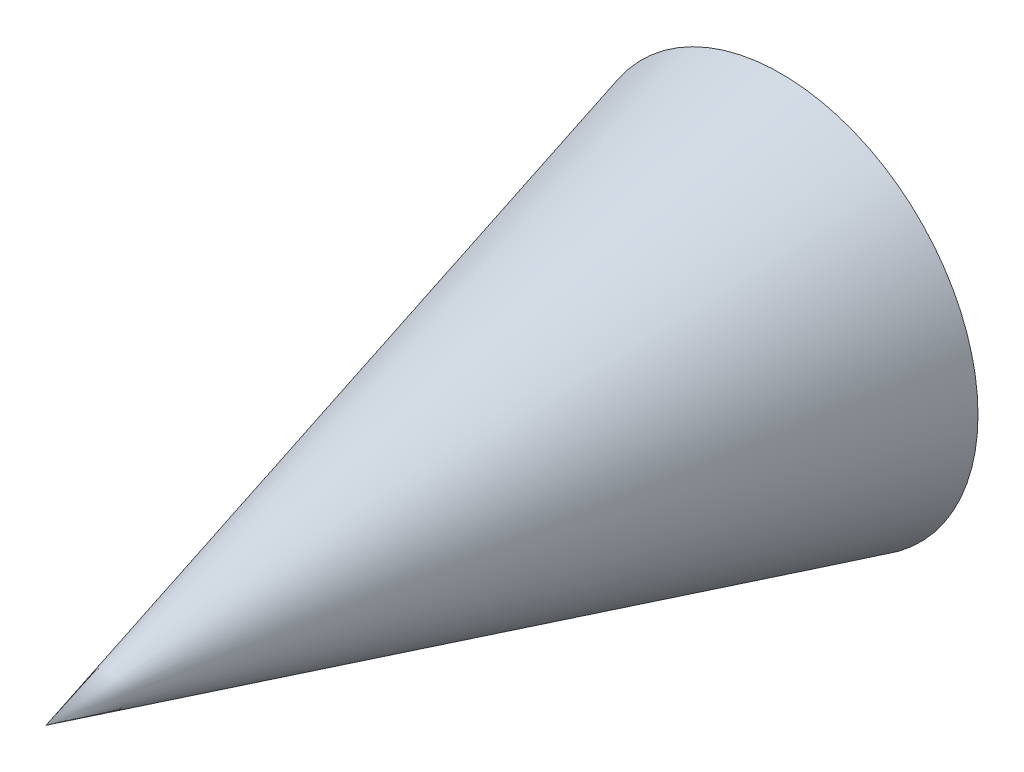
ISO-10303-21;
HEADER;
FILE_DESCRIPTION(('STEP AP214'),'2;1');
FILE_NAME('part.step','',(''),(''),'','','');
FILE_SCHEMA(('AUTOMOTIVE_DESIGN { 1 0 10303 214 1 1 1 1 }'));
ENDSEC;
DATA;
#1=APPLICATION_CONTEXT('core data for automotive mechanical design processes');
#2=APPLICATION_PROTOCOL_DEFINITION('international standard','automotive_design',2000,#1);
#3=PRODUCT_CONTEXT('',#1,'mechanical');
#4=PRODUCT('Part','Part','',(#3));
#5=PRODUCT_RELATED_PRODUCT_CATEGORY('part','',(#4));
#6=PRODUCT_DEFINITION_FORMATION('','',#4);
#7=PRODUCT_DEFINITION_CONTEXT('part definition',#1,'design');
#8=PRODUCT_DEFINITION('design','',#6,#7);
#9=PRODUCT_DEFINITION_SHAPE('','',#8);
#10=(LENGTH_UNIT() NAMED_UNIT(*) SI_UNIT(.MILLI.,.METRE.));
#11=(NAMED_UNIT(*) PLANE_ANGLE_UNIT() SI_UNIT($,.RADIAN.));
#12=(NAMED_UNIT(*) SI_UNIT($,.STERADIAN.) SOLID_ANGLE_UNIT());
#13=UNCERTAINTY_MEASURE_WITH_UNIT(LENGTH_MEASURE(1.E-05),#10,'distance_accuracy_value','');
#14=(GEOMETRIC_REPRESENTATION_CONTEXT(3) GLOBAL_UNCERTAINTY_ASSIGNED_CONTEXT((#13)) GLOBAL_UNIT_ASSIGNED_CONTEXT((#10,
#11,#12)) REPRESENTATION_CONTEXT('',''));
#15=CARTESIAN_POINT('',(0.,0.,0.));
#16=DIRECTION('',(0.,0.,1.));
#17=DIRECTION('',(1.,0.,0.));
#18=AXIS2_PLACEMENT_3D('',#15,#16,#17);
#19=CARTESIAN_POINT('',(0.,0.,0.));
#20=DIRECTION('',(0.,0.,-1.));
#21=DIRECTION('',(-1.,0.,0.));
#22=AXIS2_PLACEMENT_3D('',#19,#20,#21);
#23=CONICAL_SURFACE('',#22,0.,0.26179938779915);
#24=CARTESIAN_POINT('',(0.,0.,-27.9903810567665));
#25=DIRECTION('',(0.,0.,1.));
#26=DIRECTION('',(1.,0.,0.));
#27=AXIS2_PLACEMENT_3D('',#24,#25,#26);
#28=CIRCLE('',#27,7.5);
#29=CARTESIAN_POINT('',(7.5,0.,-27.9903810567665));
#30=VERTEX_POINT('',#29);
#31=EDGE_CURVE('E11',#30,#30,#28,.T.);
#32=ORIENTED_EDGE('',*,*,#31,.T.);
#33=EDGE_LOOP('',(#32));
#34=FACE_BOUND('',#33,.T.);
#35=CARTESIAN_POINT('',(0.,0.,0.));
#36=VERTEX_POINT('',#35);
#37=VERTEX_LOOP('',#36);
#38=FACE_BOUND('',#37,.T.);
#39=ADVANCED_FACE('F39',(#34,#38),#23,.T.);
#40=CARTESIAN_POINT('',(0.,7.5,-27.9903810567665));
#41=DIRECTION('',(0.,0.,-1.));
#42=DIRECTION('',(-1.,0.,0.));
#43=AXIS2_PLACEMENT_3D('',#40,#41,#42);
#44=PLANE('',#43);
#45=CARTESIAN_POINT('',(0.,0.,-27.9903810567665));
#46=DIRECTION('',(0.,0.,1.));
#47=DIRECTION('',(1.,0.,0.));
#48=AXIS2_PLACEMENT_3D('',#45,#46,#47);
#49=CIRCLE('',#48,6.46472381958992);
#50=CARTESIAN_POINT('',(6.46472381958992,0.,-27.9903810567665));
#51=VERTEX_POINT('',#50);
#52=EDGE_CURVE('E47',#51,#51,#49,.T.);
#53=ORIENTED_EDGE('',*,*,#52,.T.);
#54=EDGE_LOOP('',(#53));
#55=FACE_BOUND('',#54,.T.);
#56=ORIENTED_EDGE('',*,*,#31,.F.);
#57=EDGE_LOOP('',(#56));
#58=FACE_BOUND('',#57,.T.);
#59=ADVANCED_FACE('F55',(#55,#58),#44,.T.);
#60=CARTESIAN_POINT('',(0.,0.,-3.86370330515626));
#61=DIRECTION('',(0.,0.,-1.));
#62=DIRECTION('',(-1.,0.,0.));
#63=AXIS2_PLACEMENT_3D('',#60,#61,#62);
#64=CONICAL_SURFACE('',#63,0.,0.26179938779915);
#65=ORIENTED_EDGE('',*,*,#52,.F.);
#66=EDGE_LOOP('',(#65));
#67=FACE_BOUND('',#66,.T.);
#68=CARTESIAN_POINT('',(0.,0.,-3.86370330515626));
#69=VERTEX_POINT('',#68);
#70=VERTEX_LOOP('',#69);
#71=FACE_BOUND('',#70,.T.);
#72=ADVANCED_FACE('F53',(#67,#71),#64,.F.);
#73=CLOSED_SHELL('',(#39,#59,#72));
#74=MANIFOLD_SOLID_BREP('B2',#73);
#75=ADVANCED_BREP_SHAPE_REPRESENTATION('',(#18,#74),#14);
#76=SHAPE_DEFINITION_REPRESENTATION(#9,#75);
ENDSEC;
END-ISO-10303-21;
